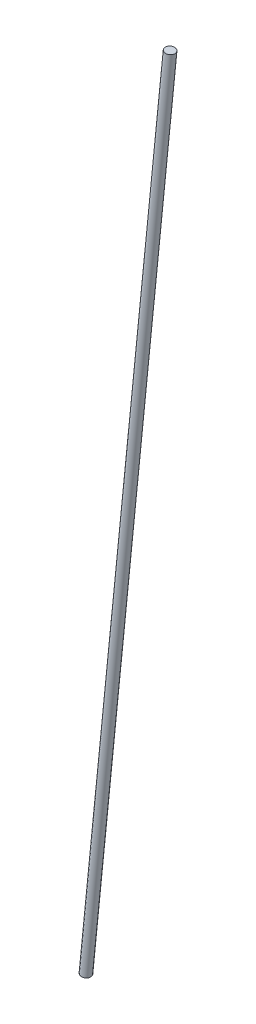
ISO-10303-21;
HEADER;
FILE_DESCRIPTION(('STEP AP214'),'2;1');
FILE_NAME('part.step','',(''),(''),'','','');
FILE_SCHEMA(('AUTOMOTIVE_DESIGN { 1 0 10303 214 1 1 1 1 }'));
ENDSEC;
DATA;
#1=APPLICATION_CONTEXT('core data for automotive mechanical design processes');
#2=APPLICATION_PROTOCOL_DEFINITION('international standard','automotive_design',2000,#1);
#3=PRODUCT_CONTEXT('',#1,'mechanical');
#4=PRODUCT('Part','Part','',(#3));
#5=PRODUCT_RELATED_PRODUCT_CATEGORY('part','',(#4));
#6=PRODUCT_DEFINITION_FORMATION('','',#4);
#7=PRODUCT_DEFINITION_CONTEXT('part definition',#1,'design');
#8=PRODUCT_DEFINITION('design','',#6,#7);
#9=PRODUCT_DEFINITION_SHAPE('','',#8);
#10=(LENGTH_UNIT() NAMED_UNIT(*) SI_UNIT(.MILLI.,.METRE.));
#11=(NAMED_UNIT(*) PLANE_ANGLE_UNIT() SI_UNIT($,.RADIAN.));
#12=(NAMED_UNIT(*) SI_UNIT($,.STERADIAN.) SOLID_ANGLE_UNIT());
#13=UNCERTAINTY_MEASURE_WITH_UNIT(LENGTH_MEASURE(1.E-05),#10,'distance_accuracy_value','');
#14=(GEOMETRIC_REPRESENTATION_CONTEXT(3) GLOBAL_UNCERTAINTY_ASSIGNED_CONTEXT((#13)) GLOBAL_UNIT_ASSIGNED_CONTEXT((#10,
#11,#12)) REPRESENTATION_CONTEXT('',''));
#15=CARTESIAN_POINT('',(0.,0.,0.));
#16=DIRECTION('',(0.,0.,1.));
#17=DIRECTION('',(1.,0.,0.));
#18=AXIS2_PLACEMENT_3D('',#15,#16,#17);
#19=CARTESIAN_POINT('',(0.,0.,0.));
#20=DIRECTION('',(-0.0995037190209985,-0.995037190209989,0.));
#21=DIRECTION('',(0.995037190209989,-0.0995037190209986,0.));
#22=AXIS2_PLACEMENT_3D('',#19,#20,#21);
#23=PLANE('',#22);
#24=CARTESIAN_POINT('',(0.,0.,0.));
#25=DIRECTION('',(-0.0995037190209985,-0.995037190209989,0.));
#26=DIRECTION('',(0.995037190209989,-0.0995037190209986,0.));
#27=AXIS2_PLACEMENT_3D('',#24,#25,#26);
#28=CIRCLE('',#27,1.5);
#29=CARTESIAN_POINT('',(1.49255578531499,-0.149255578531498,0.));
#30=VERTEX_POINT('',#29);
#31=EDGE_CURVE('E10',#30,#30,#28,.T.);
#32=ORIENTED_EDGE('',*,*,#31,.T.);
#33=EDGE_LOOP('',(#32));
#34=FACE_BOUND('',#33,.T.);
#35=ADVANCED_FACE('F31',(#34),#23,.T.);
#36=CARTESIAN_POINT('',(0.,0.,0.));
#37=DIRECTION('',(-0.0995037190209985,-0.995037190209989,0.));
#38=DIRECTION('',(0.995037190209989,-0.0995037190209986,0.));
#39=AXIS2_PLACEMENT_3D('',#36,#37,#38);
#40=CYLINDRICAL_SURFACE('',#39,1.5);
#41=CARTESIAN_POINT('',(25.9900990099009,259.90099009901,0.));
#42=DIRECTION('',(-0.0995037190209985,-0.995037190209989,0.));
#43=DIRECTION('',(0.995037190209989,-0.0995037190209986,0.));
#44=AXIS2_PLACEMENT_3D('',#41,#42,#43);
#45=CIRCLE('',#44,1.5);
#46=CARTESIAN_POINT('',(27.4826547952159,259.751734520478,0.));
#47=VERTEX_POINT('',#46);
#48=EDGE_CURVE('E37',#47,#47,#45,.T.);
#49=CARTESIAN_POINT('',(27.4826547952159,259.751734520478,0.));
#50=CARTESIAN_POINT('',(27.2119245971961,257.04443254028,0.));
#51=CARTESIAN_POINT('',(26.9411943991763,254.337130560082,0.));
#52=CARTESIAN_POINT('',(26.3997340031367,248.922526599686,0.));
#53=CARTESIAN_POINT('',(26.1290038051169,246.215224619488,0.));
#54=CARTESIAN_POINT('',(25.5875434090773,240.800620659092,0.));
#55=CARTESIAN_POINT('',(25.3168132110575,238.093318678894,0.));
#56=CARTESIAN_POINT('',(24.7753528150179,232.678714718498,0.));
#57=CARTESIAN_POINT('',(24.5046226169981,229.9714127383,0.));
#58=CARTESIAN_POINT('',(23.9631622209585,224.556808777904,0.));
#59=CARTESIAN_POINT('',(23.6924320229387,221.849506797706,0.));
#60=CARTESIAN_POINT('',(23.1509716268991,216.43490283731,0.));
#61=CARTESIAN_POINT('',(22.8802414288793,213.727600857112,0.));
#62=CARTESIAN_POINT('',(22.3387810328397,208.312996896716,0.));
#63=CARTESIAN_POINT('',(22.0680508348199,205.605694916518,0.));
#64=CARTESIAN_POINT('',(21.5265904387803,200.191090956122,0.));
#65=CARTESIAN_POINT('',(21.2558602407605,197.483788975924,0.));
#66=CARTESIAN_POINT('',(20.7143998447209,192.069185015528,0.));
#67=CARTESIAN_POINT('',(20.443669646701,189.36188303533,0.));
#68=CARTESIAN_POINT('',(19.9022092506614,183.947279074934,0.));
#69=CARTESIAN_POINT('',(19.6314790526416,181.239977094736,0.));
#70=CARTESIAN_POINT('',(19.090018656602,175.82537313434,0.));
#71=CARTESIAN_POINT('',(18.8192884585822,173.118071154142,0.));
#72=CARTESIAN_POINT('',(18.2778280625426,167.703467193746,0.));
#73=CARTESIAN_POINT('',(18.0070978645228,164.996165213548,0.));
#74=CARTESIAN_POINT('',(17.4656374684832,159.581561253152,0.));
#75=CARTESIAN_POINT('',(17.1949072704634,156.874259272954,0.));
#76=CARTESIAN_POINT('',(16.6534468744238,151.459655312558,0.));
#77=CARTESIAN_POINT('',(16.382716676404,148.75235333236,0.));
#78=CARTESIAN_POINT('',(15.8412562803644,143.337749371964,0.));
#79=CARTESIAN_POINT('',(15.5705260823446,140.630447391766,0.));
#80=CARTESIAN_POINT('',(15.029065686305,135.215843431369,0.));
#81=CARTESIAN_POINT('',(14.7583354882852,132.508541451171,0.));
#82=CARTESIAN_POINT('',(14.2168750922456,127.093937490775,0.));
#83=CARTESIAN_POINT('',(13.9461448942258,124.386635510577,0.));
#84=CARTESIAN_POINT('',(13.4046844981862,118.972031550181,0.));
#85=CARTESIAN_POINT('',(13.1339543001664,116.264729569983,0.));
#86=CARTESIAN_POINT('',(12.5924939041268,110.850125609587,0.));
#87=CARTESIAN_POINT('',(12.321763706107,108.142823629389,0.));
#88=CARTESIAN_POINT('',(11.7803033100674,102.728219668993,0.));
#89=CARTESIAN_POINT('',(11.5095731120476,100.020917688795,0.));
#90=CARTESIAN_POINT('',(10.968112716008,94.6063137283992,0.));
#91=CARTESIAN_POINT('',(10.6973825179882,91.8990117482012,0.));
#92=CARTESIAN_POINT('',(10.1559221219486,86.4844077878051,0.));
#93=CARTESIAN_POINT('',(9.88519192392882,83.7771058076071,0.));
#94=CARTESIAN_POINT('',(9.34373152788922,78.3625018472111,0.));
#95=CARTESIAN_POINT('',(9.07300132986941,75.655199867013,0.));
#96=CARTESIAN_POINT('',(8.53154093382981,70.240595906617,0.));
#97=CARTESIAN_POINT('',(8.26081073581001,67.533293926419,0.));
#98=CARTESIAN_POINT('',(7.71935033977041,62.1186899660229,0.));
#99=CARTESIAN_POINT('',(7.44862014175061,59.4113879858249,0.));
#100=CARTESIAN_POINT('',(6.907159745711,53.9967840254289,0.));
#101=CARTESIAN_POINT('',(6.6364295476912,51.2894820452309,0.));
#102=CARTESIAN_POINT('',(6.0949691516516,45.8748780848348,0.));
#103=CARTESIAN_POINT('',(5.8242389536318,43.1675761046368,0.));
#104=CARTESIAN_POINT('',(5.2827785575922,37.7529721442408,0.));
#105=CARTESIAN_POINT('',(5.0120483595724,35.0456701640428,0.));
#106=CARTESIAN_POINT('',(4.4705879635328,29.6310662036467,0.));
#107=CARTESIAN_POINT('',(4.199857765513,26.9237642234487,0.));
#108=CARTESIAN_POINT('',(3.65839736947339,21.5091602630527,0.));
#109=CARTESIAN_POINT('',(3.38766717145359,18.8018582828546,0.));
#110=CARTESIAN_POINT('',(2.84620677541399,13.3872543224586,0.));
#111=CARTESIAN_POINT('',(2.57547657739419,10.6799523422606,0.));
#112=CARTESIAN_POINT('',(2.03401618135459,5.26534838186452,0.));
#113=CARTESIAN_POINT('',(1.76328598333479,2.55804640166651,0.));
#114=CARTESIAN_POINT('',(1.49255578531499,-0.149255578531498,0.));
#115=B_SPLINE_CURVE_WITH_KNOTS('',3,(#49,#50,#51,#52,#53,#54,#55,#56,#57,#58,#59,#60,#61,#62,
#63,#64,#65,#66,#67,#68,#69,#70,#71,#72,#73,#74,#75,#76,#77,#78,#79,#80,#81,#82,#83,#84,#85,#86,
#87,#88,#89,#90,#91,#92,#93,#94,#95,#96,#97,#98,#99,#100,#101,#102,#103,#104,#105,#106,#107,
#108,#109,#110,#111,#112,#113,#114),.UNSPECIFIED.,.F.,.F.,(4,2,2,2,2,2,2,2,2,2,2,2,2,2,2,2,2,2,
2,2,2,2,2,2,2,2,2,2,2,2,2,2,4),(0.,8.16241445094129,16.3248289018826,24.4872433528239,
32.6496578037652,40.8120722547066,48.9744867056479,57.1369011565892,65.2993156075305,
73.4617300584718,81.6241445094131,89.7865589603545,97.9489734112958,106.111387862237,
114.273802313178,122.43621676412,130.598631215061,138.761045666002,146.923460116944,
155.085874567885,163.248289018826,171.410703469768,179.573117920709,187.73553237165,
195.897946822592,204.060361273533,212.222775724474,220.385190175415,228.547604626357,
236.710019077298,244.872433528239,253.034847979181,261.197262430122),.UNSPECIFIED.);
#116=EDGE_CURVE('BSEAM43',#47,#30,#115,.T.);
#117=ORIENTED_EDGE('',*,*,#48,.T.);
#118=ORIENTED_EDGE('',*,*,#31,.F.);
#119=ORIENTED_EDGE('',*,*,#116,.T.);
#120=ORIENTED_EDGE('',*,*,#116,.F.);
#121=EDGE_LOOP('',(#117,#119,#118,#120));
#122=FACE_BOUND('',#121,.T.);
#123=ADVANCED_FACE('F43',(#122),#40,.T.);
#124=CARTESIAN_POINT('',(25.9900990099009,259.90099009901,0.));
#125=DIRECTION('',(0.0995037190209985,0.995037190209989,0.));
#126=DIRECTION('',(-0.995037190209989,0.0995037190209986,0.));
#127=AXIS2_PLACEMENT_3D('',#124,#125,#126);
#128=PLANE('',#127);
#129=ORIENTED_EDGE('',*,*,#48,.F.);
#130=EDGE_LOOP('',(#129));
#131=FACE_BOUND('',#130,.T.);
#132=ADVANCED_FACE('F46',(#131),#128,.T.);
#133=CLOSED_SHELL('',(#35,#123,#132));
#134=MANIFOLD_SOLID_BREP('B2',#133);
#135=ADVANCED_BREP_SHAPE_REPRESENTATION('',(#18,#134),#14);
#136=SHAPE_DEFINITION_REPRESENTATION(#9,#135);
ENDSEC;
END-ISO-10303-21;
